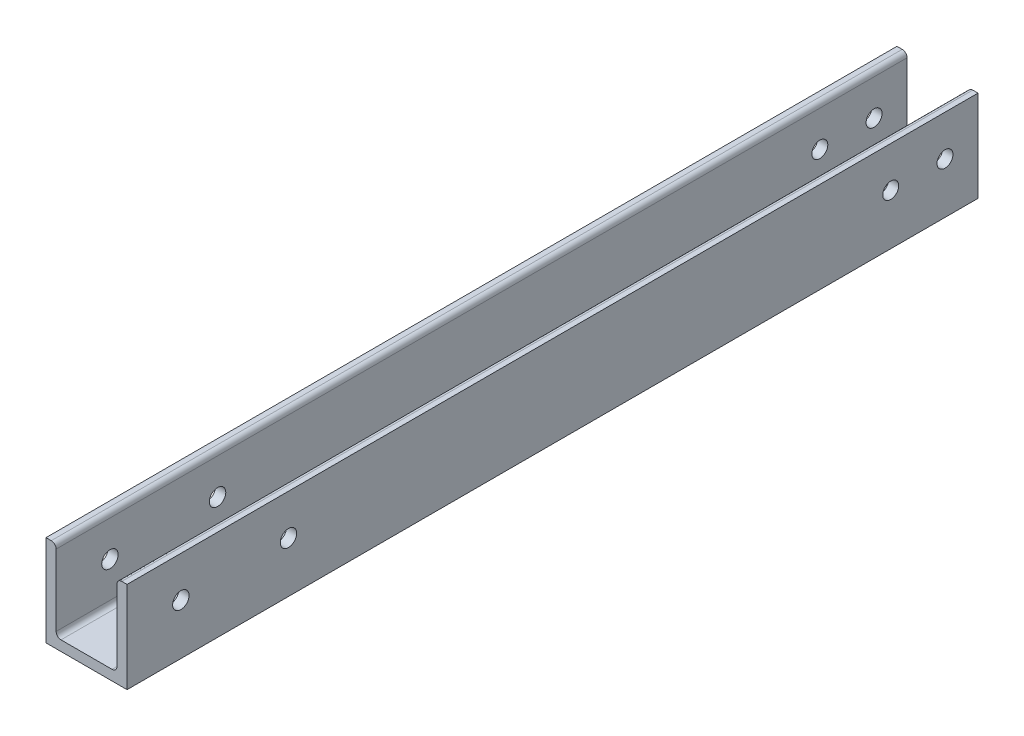
ISO-10303-21;
HEADER;
FILE_DESCRIPTION(('STEP AP214'),'2;1');
FILE_NAME('part.step','',(''),(''),'','','');
FILE_SCHEMA(('AUTOMOTIVE_DESIGN { 1 0 10303 214 1 1 1 1 }'));
ENDSEC;
DATA;
#1=APPLICATION_CONTEXT('core data for automotive mechanical design processes');
#2=APPLICATION_PROTOCOL_DEFINITION('international standard','automotive_design',2000,#1);
#3=PRODUCT_CONTEXT('',#1,'mechanical');
#4=PRODUCT('Part','Part','',(#3));
#5=PRODUCT_RELATED_PRODUCT_CATEGORY('part','',(#4));
#6=PRODUCT_DEFINITION_FORMATION('','',#4);
#7=PRODUCT_DEFINITION_CONTEXT('part definition',#1,'design');
#8=PRODUCT_DEFINITION('design','',#6,#7);
#9=PRODUCT_DEFINITION_SHAPE('','',#8);
#10=(LENGTH_UNIT() NAMED_UNIT(*) SI_UNIT(.MILLI.,.METRE.));
#11=(NAMED_UNIT(*) PLANE_ANGLE_UNIT() SI_UNIT($,.RADIAN.));
#12=(NAMED_UNIT(*) SI_UNIT($,.STERADIAN.) SOLID_ANGLE_UNIT());
#13=UNCERTAINTY_MEASURE_WITH_UNIT(LENGTH_MEASURE(1.E-05),#10,'distance_accuracy_value','');
#14=(GEOMETRIC_REPRESENTATION_CONTEXT(3) GLOBAL_UNCERTAINTY_ASSIGNED_CONTEXT((#13)) GLOBAL_UNIT_ASSIGNED_CONTEXT((#10,
#11,#12)) REPRESENTATION_CONTEXT('',''));
#15=CARTESIAN_POINT('',(0.,0.,0.));
#16=DIRECTION('',(0.,0.,1.));
#17=DIRECTION('',(1.,0.,0.));
#18=AXIS2_PLACEMENT_3D('',#15,#16,#17);
#19=CARTESIAN_POINT('',(-12.7,0.,266.7));
#20=DIRECTION('',(0.,1.,0.));
#21=DIRECTION('',(-1.,0.,0.));
#22=AXIS2_PLACEMENT_3D('',#19,#20,#21);
#23=PLANE('',#22);
#24=DIRECTION('',(1.,0.,0.));
#25=VECTOR('',#24,1.);
#26=CARTESIAN_POINT('',(-12.7,0.,0.));
#27=LINE('',#26,#25);
#28=CARTESIAN_POINT('',(-12.7,0.,0.));
#29=VERTEX_POINT('',#28);
#30=CARTESIAN_POINT('',(12.7,0.,0.));
#31=VERTEX_POINT('',#30);
#32=EDGE_CURVE('E163',#29,#31,#27,.T.);
#33=ORIENTED_EDGE('',*,*,#32,.T.);
#34=DIRECTION('',(0.,0.,-1.));
#35=VECTOR('',#34,1.);
#36=CARTESIAN_POINT('',(12.7,0.,266.7));
#37=LINE('',#36,#35);
#38=CARTESIAN_POINT('',(12.7,0.,266.7));
#39=VERTEX_POINT('',#38);
#40=EDGE_CURVE('E47',#39,#31,#37,.T.);
#41=ORIENTED_EDGE('',*,*,#40,.F.);
#42=DIRECTION('',(1.,0.,0.));
#43=VECTOR('',#42,1.);
#44=CARTESIAN_POINT('',(-12.7,0.,266.7));
#45=LINE('',#44,#43);
#46=CARTESIAN_POINT('',(-12.7,0.,266.7));
#47=VERTEX_POINT('',#46);
#48=EDGE_CURVE('E111',#47,#39,#45,.T.);
#49=ORIENTED_EDGE('',*,*,#48,.F.);
#50=DIRECTION('',(0.,0.,-1.));
#51=VECTOR('',#50,1.);
#52=CARTESIAN_POINT('',(-12.7,0.,266.7));
#53=LINE('',#52,#51);
#54=EDGE_CURVE('E11',#47,#29,#53,.T.);
#55=ORIENTED_EDGE('',*,*,#54,.T.);
#56=EDGE_LOOP('',(#33,#41,#49,#55));
#57=FACE_BOUND('',#56,.T.);
#58=ADVANCED_FACE('F39',(#57),#23,.F.);
#59=CARTESIAN_POINT('',(12.7,6.35,266.7));
#60=DIRECTION('',(-1.,0.,0.));
#61=DIRECTION('',(0.,-1.,0.));
#62=AXIS2_PLACEMENT_3D('',#59,#60,#61);
#63=PLANE('',#62);
#64=CARTESIAN_POINT('',(12.7,15.8750000003487,10.3499999999998));
#65=DIRECTION('',(-1.,0.,0.));
#66=DIRECTION('',(0.,0.,1.));
#67=AXIS2_PLACEMENT_3D('',#64,#65,#66);
#68=CIRCLE('',#67,2.5);
#69=CARTESIAN_POINT('',(12.7,15.8750000003487,12.8499999999998));
#70=VERTEX_POINT('',#69);
#71=EDGE_CURVE('E280',#70,#70,#68,.T.);
#72=ORIENTED_EDGE('',*,*,#71,.T.);
#73=EDGE_LOOP('',(#72));
#74=FACE_BOUND('',#73,.T.);
#75=CARTESIAN_POINT('',(12.7,15.8750000003487,27.3499999999998));
#76=DIRECTION('',(-1.,0.,0.));
#77=DIRECTION('',(0.,0.,1.));
#78=AXIS2_PLACEMENT_3D('',#75,#76,#77);
#79=CIRCLE('',#78,2.5);
#80=CARTESIAN_POINT('',(12.7,15.8750000003487,29.8499999999998));
#81=VERTEX_POINT('',#80);
#82=EDGE_CURVE('E284',#81,#81,#79,.T.);
#83=ORIENTED_EDGE('',*,*,#82,.T.);
#84=EDGE_LOOP('',(#83));
#85=FACE_BOUND('',#84,.T.);
#86=CARTESIAN_POINT('',(12.7,15.875,216.108705961791));
#87=DIRECTION('',(1.,0.,0.));
#88=DIRECTION('',(0.,1.,0.));
#89=AXIS2_PLACEMENT_3D('',#86,#87,#88);
#90=CIRCLE('',#89,2.575);
#91=CARTESIAN_POINT('',(12.7,18.45,216.108705961791));
#92=VERTEX_POINT('',#91);
#93=EDGE_CURVE('E288',#92,#92,#90,.T.);
#94=ORIENTED_EDGE('',*,*,#93,.F.);
#95=EDGE_LOOP('',(#94));
#96=FACE_BOUND('',#95,.T.);
#97=CARTESIAN_POINT('',(12.7,15.875,249.836235320597));
#98=DIRECTION('',(1.,0.,0.));
#99=DIRECTION('',(0.,1.,0.));
#100=AXIS2_PLACEMENT_3D('',#97,#98,#99);
#101=CIRCLE('',#100,2.575);
#102=CARTESIAN_POINT('',(12.7,18.45,249.836235320597));
#103=VERTEX_POINT('',#102);
#104=EDGE_CURVE('E291',#103,#103,#101,.T.);
#105=ORIENTED_EDGE('',*,*,#104,.F.);
#106=EDGE_LOOP('',(#105));
#107=FACE_BOUND('',#106,.T.);
#108=DIRECTION('',(0.,1.,0.));
#109=VECTOR('',#108,1.);
#110=CARTESIAN_POINT('',(12.7,6.35,0.));
#111=LINE('',#110,#109);
#112=CARTESIAN_POINT('',(12.7,28.575,0.));
#113=VERTEX_POINT('',#112);
#114=EDGE_CURVE('E166',#31,#113,#111,.T.);
#115=ORIENTED_EDGE('',*,*,#114,.T.);
#116=DIRECTION('',(0.,0.,-1.));
#117=VECTOR('',#116,1.);
#118=CARTESIAN_POINT('',(12.7,28.575,266.7));
#119=LINE('',#118,#117);
#120=CARTESIAN_POINT('',(12.7,28.575,266.7));
#121=VERTEX_POINT('',#120);
#122=EDGE_CURVE('E204',#121,#113,#119,.T.);
#123=ORIENTED_EDGE('',*,*,#122,.F.);
#124=DIRECTION('',(0.,1.,0.));
#125=VECTOR('',#124,1.);
#126=CARTESIAN_POINT('',(12.7,0.,266.7));
#127=LINE('',#126,#125);
#128=EDGE_CURVE('E211',#39,#121,#127,.T.);
#129=ORIENTED_EDGE('',*,*,#128,.F.);
#130=ORIENTED_EDGE('',*,*,#40,.T.);
#131=EDGE_LOOP('',(#115,#123,#129,#130));
#132=FACE_BOUND('',#131,.T.);
#133=ADVANCED_FACE('F209',(#74,#85,#96,#107,#132),#63,.F.);
#134=CARTESIAN_POINT('',(12.7,28.575,266.7));
#135=DIRECTION('',(0.,-1.,0.));
#136=DIRECTION('',(1.,0.,0.));
#137=AXIS2_PLACEMENT_3D('',#134,#135,#136);
#138=PLANE('',#137);
#139=DIRECTION('',(-1.,0.,0.));
#140=VECTOR('',#139,1.);
#141=CARTESIAN_POINT('',(12.7,28.575,0.));
#142=LINE('',#141,#140);
#143=CARTESIAN_POINT('',(11.049,28.575,0.));
#144=VERTEX_POINT('',#143);
#145=EDGE_CURVE('E169',#113,#144,#142,.T.);
#146=ORIENTED_EDGE('',*,*,#145,.T.);
#147=DIRECTION('',(0.,0.,-1.));
#148=VECTOR('',#147,1.);
#149=CARTESIAN_POINT('',(11.049,28.575,266.7));
#150=LINE('',#149,#148);
#151=CARTESIAN_POINT('',(11.049,28.575,266.7));
#152=VERTEX_POINT('',#151);
#153=EDGE_CURVE('E201',#152,#144,#150,.T.);
#154=ORIENTED_EDGE('',*,*,#153,.F.);
#155=DIRECTION('',(-1.,0.,0.));
#156=VECTOR('',#155,1.);
#157=CARTESIAN_POINT('',(12.7,28.575,266.7));
#158=LINE('',#157,#156);
#159=EDGE_CURVE('E230',#121,#152,#158,.T.);
#160=ORIENTED_EDGE('',*,*,#159,.F.);
#161=ORIENTED_EDGE('',*,*,#122,.T.);
#162=EDGE_LOOP('',(#146,#154,#160,#161));
#163=FACE_BOUND('',#162,.T.);
#164=ADVANCED_FACE('F221',(#163),#138,.F.);
#165=CARTESIAN_POINT('',(11.049,27.051,266.7));
#166=DIRECTION('',(0.,0.,-1.));
#167=DIRECTION('',(-1.,0.,0.));
#168=AXIS2_PLACEMENT_3D('',#165,#166,#167);
#169=CYLINDRICAL_SURFACE('',#168,1.524);
#170=CARTESIAN_POINT('',(11.049,27.051,0.));
#171=DIRECTION('',(0.,0.,1.));
#172=DIRECTION('',(1.,0.,0.));
#173=AXIS2_PLACEMENT_3D('',#170,#171,#172);
#174=CIRCLE('',#173,1.524);
#175=CARTESIAN_POINT('',(9.52499999999999,27.051,0.));
#176=VERTEX_POINT('',#175);
#177=EDGE_CURVE('E171',#144,#176,#174,.T.);
#178=ORIENTED_EDGE('',*,*,#177,.T.);
#179=DIRECTION('',(0.,0.,-1.));
#180=VECTOR('',#179,1.);
#181=CARTESIAN_POINT('',(9.52499999999999,27.051,266.7));
#182=LINE('',#181,#180);
#183=CARTESIAN_POINT('',(9.52499999999999,27.051,266.7));
#184=VERTEX_POINT('',#183);
#185=EDGE_CURVE('E198',#184,#176,#182,.T.);
#186=ORIENTED_EDGE('',*,*,#185,.F.);
#187=CARTESIAN_POINT('',(11.049,27.051,266.7));
#188=DIRECTION('',(0.,0.,1.));
#189=DIRECTION('',(1.,0.,0.));
#190=AXIS2_PLACEMENT_3D('',#187,#188,#189);
#191=CIRCLE('',#190,1.524);
#192=EDGE_CURVE('E227',#152,#184,#191,.T.);
#193=ORIENTED_EDGE('',*,*,#192,.F.);
#194=ORIENTED_EDGE('',*,*,#153,.T.);
#195=EDGE_LOOP('',(#178,#186,#193,#194));
#196=FACE_BOUND('',#195,.T.);
#197=ADVANCED_FACE('F225',(#196),#169,.T.);
#198=CARTESIAN_POINT('',(9.52499999999999,4.699,266.7));
#199=DIRECTION('',(1.,0.,0.));
#200=DIRECTION('',(0.,1.,0.));
#201=AXIS2_PLACEMENT_3D('',#198,#199,#200);
#202=PLANE('',#201);
#203=CARTESIAN_POINT('',(9.52499999999999,15.8750000003487,10.3499999999998));
#204=DIRECTION('',(1.,0.,0.));
#205=DIRECTION('',(0.,1.,0.));
#206=AXIS2_PLACEMENT_3D('',#203,#204,#205);
#207=CIRCLE('',#206,2.5);
#208=CARTESIAN_POINT('',(9.52499999999999,18.3750000003487,10.3499999999998));
#209=VERTEX_POINT('',#208);
#210=EDGE_CURVE('E298',#209,#209,#207,.T.);
#211=ORIENTED_EDGE('',*,*,#210,.T.);
#212=EDGE_LOOP('',(#211));
#213=FACE_BOUND('',#212,.T.);
#214=CARTESIAN_POINT('',(9.52499999999999,15.8750000003487,27.3499999999998));
#215=DIRECTION('',(1.,0.,0.));
#216=DIRECTION('',(0.,1.,0.));
#217=AXIS2_PLACEMENT_3D('',#214,#215,#216);
#218=CIRCLE('',#217,2.5);
#219=CARTESIAN_POINT('',(9.52499999999999,18.3750000003487,27.3499999999998));
#220=VERTEX_POINT('',#219);
#221=EDGE_CURVE('E461',#220,#220,#218,.T.);
#222=ORIENTED_EDGE('',*,*,#221,.T.);
#223=EDGE_LOOP('',(#222));
#224=FACE_BOUND('',#223,.T.);
#225=CARTESIAN_POINT('',(9.52499999999999,15.875,216.108705961791));
#226=DIRECTION('',(1.,0.,0.));
#227=DIRECTION('',(0.,1.,0.));
#228=AXIS2_PLACEMENT_3D('',#225,#226,#227);
#229=CIRCLE('',#228,2.575);
#230=CARTESIAN_POINT('',(9.52499999999999,18.45,216.108705961791));
#231=VERTEX_POINT('',#230);
#232=EDGE_CURVE('E167',#231,#231,#229,.T.);
#233=ORIENTED_EDGE('',*,*,#232,.T.);
#234=EDGE_LOOP('',(#233));
#235=FACE_BOUND('',#234,.T.);
#236=CARTESIAN_POINT('',(9.52499999999999,15.875,249.836235320597));
#237=DIRECTION('',(1.,0.,0.));
#238=DIRECTION('',(0.,1.,0.));
#239=AXIS2_PLACEMENT_3D('',#236,#237,#238);
#240=CIRCLE('',#239,2.575);
#241=CARTESIAN_POINT('',(9.52499999999999,18.45,249.836235320597));
#242=VERTEX_POINT('',#241);
#243=EDGE_CURVE('E305',#242,#242,#240,.T.);
#244=ORIENTED_EDGE('',*,*,#243,.T.);
#245=EDGE_LOOP('',(#244));
#246=FACE_BOUND('',#245,.T.);
#247=DIRECTION('',(0.,-1.,0.));
#248=VECTOR('',#247,1.);
#249=CARTESIAN_POINT('',(9.52499999999999,4.699,0.));
#250=LINE('',#249,#248);
#251=CARTESIAN_POINT('',(9.52499999999999,4.699,0.));
#252=VERTEX_POINT('',#251);
#253=EDGE_CURVE('E173',#176,#252,#250,.T.);
#254=ORIENTED_EDGE('',*,*,#253,.T.);
#255=DIRECTION('',(0.,0.,-1.));
#256=VECTOR('',#255,1.);
#257=CARTESIAN_POINT('',(9.52499999999999,4.699,266.7));
#258=LINE('',#257,#256);
#259=CARTESIAN_POINT('',(9.52499999999999,4.699,266.7));
#260=VERTEX_POINT('',#259);
#261=EDGE_CURVE('E195',#260,#252,#258,.T.);
#262=ORIENTED_EDGE('',*,*,#261,.F.);
#263=DIRECTION('',(0.,-1.,0.));
#264=VECTOR('',#263,1.);
#265=CARTESIAN_POINT('',(9.52499999999999,4.699,266.7));
#266=LINE('',#265,#264);
#267=EDGE_CURVE('E229',#184,#260,#266,.T.);
#268=ORIENTED_EDGE('',*,*,#267,.F.);
#269=ORIENTED_EDGE('',*,*,#185,.T.);
#270=EDGE_LOOP('',(#254,#262,#268,#269));
#271=FACE_BOUND('',#270,.T.);
#272=ADVANCED_FACE('F254',(#213,#224,#235,#246,#271),#202,.F.);
#273=CARTESIAN_POINT('',(8.00099999999999,4.699,266.7));
#274=DIRECTION('',(0.,0.,-1.));
#275=DIRECTION('',(-1.,0.,0.));
#276=AXIS2_PLACEMENT_3D('',#273,#274,#275);
#277=CYLINDRICAL_SURFACE('',#276,1.524);
#278=CARTESIAN_POINT('',(8.00099999999999,4.699,0.));
#279=DIRECTION('',(0.,0.,-1.));
#280=DIRECTION('',(1.,0.,0.));
#281=AXIS2_PLACEMENT_3D('',#278,#279,#280);
#282=CIRCLE('',#281,1.524);
#283=CARTESIAN_POINT('',(8.00099999999999,3.175,0.));
#284=VERTEX_POINT('',#283);
#285=EDGE_CURVE('E175',#252,#284,#282,.T.);
#286=ORIENTED_EDGE('',*,*,#285,.T.);
#287=DIRECTION('',(0.,0.,-1.));
#288=VECTOR('',#287,1.);
#289=CARTESIAN_POINT('',(8.00099999999999,3.175,266.7));
#290=LINE('',#289,#288);
#291=CARTESIAN_POINT('',(8.00099999999999,3.175,266.7));
#292=VERTEX_POINT('',#291);
#293=EDGE_CURVE('E192',#292,#284,#290,.T.);
#294=ORIENTED_EDGE('',*,*,#293,.F.);
#295=CARTESIAN_POINT('',(8.00099999999999,4.699,266.7));
#296=DIRECTION('',(0.,0.,-1.));
#297=DIRECTION('',(1.,0.,0.));
#298=AXIS2_PLACEMENT_3D('',#295,#296,#297);
#299=CIRCLE('',#298,1.524);
#300=EDGE_CURVE('E232',#260,#292,#299,.T.);
#301=ORIENTED_EDGE('',*,*,#300,.F.);
#302=ORIENTED_EDGE('',*,*,#261,.T.);
#303=EDGE_LOOP('',(#286,#294,#301,#302));
#304=FACE_BOUND('',#303,.T.);
#305=ADVANCED_FACE('F251',(#304),#277,.F.);
#306=CARTESIAN_POINT('',(-8.001,3.175,266.7));
#307=DIRECTION('',(0.,-1.,0.));
#308=DIRECTION('',(0.,0.,-1.));
#309=AXIS2_PLACEMENT_3D('',#306,#307,#308);
#310=PLANE('',#309);
#311=DIRECTION('',(-1.,0.,0.));
#312=VECTOR('',#311,1.);
#313=CARTESIAN_POINT('',(-8.001,3.175,0.));
#314=LINE('',#313,#312);
#315=CARTESIAN_POINT('',(-8.001,3.175,0.));
#316=VERTEX_POINT('',#315);
#317=EDGE_CURVE('E177',#284,#316,#314,.T.);
#318=ORIENTED_EDGE('',*,*,#317,.T.);
#319=DIRECTION('',(0.,0.,-1.));
#320=VECTOR('',#319,1.);
#321=CARTESIAN_POINT('',(-8.001,3.175,266.7));
#322=LINE('',#321,#320);
#323=CARTESIAN_POINT('',(-8.001,3.175,266.7));
#324=VERTEX_POINT('',#323);
#325=EDGE_CURVE('E189',#324,#316,#322,.T.);
#326=ORIENTED_EDGE('',*,*,#325,.F.);
#327=DIRECTION('',(-1.,0.,0.));
#328=VECTOR('',#327,1.);
#329=CARTESIAN_POINT('',(-8.001,3.175,266.7));
#330=LINE('',#329,#328);
#331=EDGE_CURVE('E238',#292,#324,#330,.T.);
#332=ORIENTED_EDGE('',*,*,#331,.F.);
#333=ORIENTED_EDGE('',*,*,#293,.T.);
#334=EDGE_LOOP('',(#318,#326,#332,#333));
#335=FACE_BOUND('',#334,.T.);
#336=ADVANCED_FACE('F244',(#335),#310,.F.);
#337=CARTESIAN_POINT('',(-8.001,4.699,266.7));
#338=DIRECTION('',(0.,0.,-1.));
#339=DIRECTION('',(-1.,0.,0.));
#340=AXIS2_PLACEMENT_3D('',#337,#338,#339);
#341=CYLINDRICAL_SURFACE('',#340,1.524);
#342=CARTESIAN_POINT('',(-8.001,4.699,0.));
#343=DIRECTION('',(0.,0.,-1.));
#344=DIRECTION('',(-1.,0.,0.));
#345=AXIS2_PLACEMENT_3D('',#342,#343,#344);
#346=CIRCLE('',#345,1.524);
#347=CARTESIAN_POINT('',(-9.525,4.699,0.));
#348=VERTEX_POINT('',#347);
#349=EDGE_CURVE('E179',#316,#348,#346,.T.);
#350=ORIENTED_EDGE('',*,*,#349,.T.);
#351=DIRECTION('',(0.,0.,-1.));
#352=VECTOR('',#351,1.);
#353=CARTESIAN_POINT('',(-9.525,4.699,266.7));
#354=LINE('',#353,#352);
#355=CARTESIAN_POINT('',(-9.525,4.699,266.7));
#356=VERTEX_POINT('',#355);
#357=EDGE_CURVE('E152',#356,#348,#354,.T.);
#358=ORIENTED_EDGE('',*,*,#357,.F.);
#359=CARTESIAN_POINT('',(-8.001,4.699,266.7));
#360=DIRECTION('',(0.,0.,-1.));
#361=DIRECTION('',(-1.,0.,0.));
#362=AXIS2_PLACEMENT_3D('',#359,#360,#361);
#363=CIRCLE('',#362,1.524);
#364=EDGE_CURVE('E143',#324,#356,#363,.T.);
#365=ORIENTED_EDGE('',*,*,#364,.F.);
#366=ORIENTED_EDGE('',*,*,#325,.T.);
#367=EDGE_LOOP('',(#350,#358,#365,#366));
#368=FACE_BOUND('',#367,.T.);
#369=ADVANCED_FACE('F248',(#368),#341,.F.);
#370=CARTESIAN_POINT('',(-9.525,4.699,266.7));
#371=DIRECTION('',(-1.,0.,0.));
#372=DIRECTION('',(0.,0.,1.));
#373=AXIS2_PLACEMENT_3D('',#370,#371,#372);
#374=PLANE('',#373);
#375=CARTESIAN_POINT('',(-9.525,15.8750000003487,10.3499999999998));
#376=DIRECTION('',(-1.,0.,0.));
#377=DIRECTION('',(0.,0.,1.));
#378=AXIS2_PLACEMENT_3D('',#375,#376,#377);
#379=CIRCLE('',#378,2.5);
#380=CARTESIAN_POINT('',(-9.525,15.8750000003487,12.8499999999998));
#381=VERTEX_POINT('',#380);
#382=EDGE_CURVE('E458',#381,#381,#379,.T.);
#383=ORIENTED_EDGE('',*,*,#382,.T.);
#384=EDGE_LOOP('',(#383));
#385=FACE_BOUND('',#384,.T.);
#386=CARTESIAN_POINT('',(-9.525,15.8750000003487,27.3499999999998));
#387=DIRECTION('',(-1.,0.,0.));
#388=DIRECTION('',(0.,0.,1.));
#389=AXIS2_PLACEMENT_3D('',#386,#387,#388);
#390=CIRCLE('',#389,2.5);
#391=CARTESIAN_POINT('',(-9.525,15.8750000003487,29.8499999999998));
#392=VERTEX_POINT('',#391);
#393=EDGE_CURVE('E477',#392,#392,#390,.T.);
#394=ORIENTED_EDGE('',*,*,#393,.T.);
#395=EDGE_LOOP('',(#394));
#396=FACE_BOUND('',#395,.T.);
#397=CARTESIAN_POINT('',(-9.525,15.875,216.108705961791));
#398=DIRECTION('',(-1.,0.,0.));
#399=DIRECTION('',(0.,0.,1.));
#400=AXIS2_PLACEMENT_3D('',#397,#398,#399);
#401=CIRCLE('',#400,2.575);
#402=CARTESIAN_POINT('',(-9.525,15.875,218.683705961791));
#403=VERTEX_POINT('',#402);
#404=EDGE_CURVE('E308',#403,#403,#401,.T.);
#405=ORIENTED_EDGE('',*,*,#404,.T.);
#406=EDGE_LOOP('',(#405));
#407=FACE_BOUND('',#406,.T.);
#408=CARTESIAN_POINT('',(-9.525,15.875,249.836235320597));
#409=DIRECTION('',(-1.,0.,0.));
#410=DIRECTION('',(0.,0.,1.));
#411=AXIS2_PLACEMENT_3D('',#408,#409,#410);
#412=CIRCLE('',#411,2.575);
#413=CARTESIAN_POINT('',(-9.525,15.875,252.411235320597));
#414=VERTEX_POINT('',#413);
#415=EDGE_CURVE('E302',#414,#414,#412,.T.);
#416=ORIENTED_EDGE('',*,*,#415,.T.);
#417=EDGE_LOOP('',(#416));
#418=FACE_BOUND('',#417,.T.);
#419=DIRECTION('',(0.,1.,0.));
#420=VECTOR('',#419,1.);
#421=CARTESIAN_POINT('',(-9.525,4.699,0.));
#422=LINE('',#421,#420);
#423=CARTESIAN_POINT('',(-9.525,27.051,0.));
#424=VERTEX_POINT('',#423);
#425=EDGE_CURVE('E151',#348,#424,#422,.T.);
#426=ORIENTED_EDGE('',*,*,#425,.T.);
#427=DIRECTION('',(0.,0.,-1.));
#428=VECTOR('',#427,1.);
#429=CARTESIAN_POINT('',(-9.525,27.051,266.7));
#430=LINE('',#429,#428);
#431=CARTESIAN_POINT('',(-9.525,27.051,266.7));
#432=VERTEX_POINT('',#431);
#433=EDGE_CURVE('E148',#432,#424,#430,.T.);
#434=ORIENTED_EDGE('',*,*,#433,.F.);
#435=DIRECTION('',(0.,1.,0.));
#436=VECTOR('',#435,1.);
#437=CARTESIAN_POINT('',(-9.525,4.699,266.7));
#438=LINE('',#437,#436);
#439=EDGE_CURVE('E137',#356,#432,#438,.T.);
#440=ORIENTED_EDGE('',*,*,#439,.F.);
#441=ORIENTED_EDGE('',*,*,#357,.T.);
#442=EDGE_LOOP('',(#426,#434,#440,#441));
#443=FACE_BOUND('',#442,.T.);
#444=ADVANCED_FACE('F149',(#385,#396,#407,#418,#443),#374,.F.);
#445=CARTESIAN_POINT('',(-11.049,27.051,266.7));
#446=DIRECTION('',(0.,0.,-1.));
#447=DIRECTION('',(-1.,0.,0.));
#448=AXIS2_PLACEMENT_3D('',#445,#446,#447);
#449=CYLINDRICAL_SURFACE('',#448,1.524);
#450=CARTESIAN_POINT('',(-11.049,27.051,0.));
#451=DIRECTION('',(0.,0.,1.));
#452=DIRECTION('',(-1.,0.,0.));
#453=AXIS2_PLACEMENT_3D('',#450,#451,#452);
#454=CIRCLE('',#453,1.524);
#455=CARTESIAN_POINT('',(-11.049,28.575,0.));
#456=VERTEX_POINT('',#455);
#457=EDGE_CURVE('E97',#424,#456,#454,.T.);
#458=ORIENTED_EDGE('',*,*,#457,.T.);
#459=DIRECTION('',(0.,0.,-1.));
#460=VECTOR('',#459,1.);
#461=CARTESIAN_POINT('',(-11.049,28.575,266.7));
#462=LINE('',#461,#460);
#463=CARTESIAN_POINT('',(-11.049,28.575,266.7));
#464=VERTEX_POINT('',#463);
#465=EDGE_CURVE('E153',#464,#456,#462,.T.);
#466=ORIENTED_EDGE('',*,*,#465,.F.);
#467=CARTESIAN_POINT('',(-11.049,27.051,266.7));
#468=DIRECTION('',(0.,0.,1.));
#469=DIRECTION('',(-1.,0.,0.));
#470=AXIS2_PLACEMENT_3D('',#467,#468,#469);
#471=CIRCLE('',#470,1.524);
#472=EDGE_CURVE('E141',#432,#464,#471,.T.);
#473=ORIENTED_EDGE('',*,*,#472,.F.);
#474=ORIENTED_EDGE('',*,*,#433,.T.);
#475=EDGE_LOOP('',(#458,#466,#473,#474));
#476=FACE_BOUND('',#475,.T.);
#477=ADVANCED_FACE('F155',(#476),#449,.T.);
#478=CARTESIAN_POINT('',(-12.7,28.575,266.7));
#479=DIRECTION('',(0.,-1.,0.));
#480=DIRECTION('',(0.,0.,-1.));
#481=AXIS2_PLACEMENT_3D('',#478,#479,#480);
#482=PLANE('',#481);
#483=DIRECTION('',(-1.,0.,0.));
#484=VECTOR('',#483,1.);
#485=CARTESIAN_POINT('',(-12.7,28.575,0.));
#486=LINE('',#485,#484);
#487=CARTESIAN_POINT('',(-12.7,28.575,0.));
#488=VERTEX_POINT('',#487);
#489=EDGE_CURVE('E104',#456,#488,#486,.T.);
#490=ORIENTED_EDGE('',*,*,#489,.T.);
#491=DIRECTION('',(0.,0.,-1.));
#492=VECTOR('',#491,1.);
#493=CARTESIAN_POINT('',(-12.7,28.575,266.7));
#494=LINE('',#493,#492);
#495=CARTESIAN_POINT('',(-12.7,28.575,266.7));
#496=VERTEX_POINT('',#495);
#497=EDGE_CURVE('E159',#496,#488,#494,.T.);
#498=ORIENTED_EDGE('',*,*,#497,.F.);
#499=DIRECTION('',(-1.,0.,0.));
#500=VECTOR('',#499,1.);
#501=CARTESIAN_POINT('',(-12.7,28.575,266.7));
#502=LINE('',#501,#500);
#503=EDGE_CURVE('E157',#464,#496,#502,.T.);
#504=ORIENTED_EDGE('',*,*,#503,.F.);
#505=ORIENTED_EDGE('',*,*,#465,.T.);
#506=EDGE_LOOP('',(#490,#498,#504,#505));
#507=FACE_BOUND('',#506,.T.);
#508=ADVANCED_FACE('F315',(#507),#482,.F.);
#509=CARTESIAN_POINT('',(-12.7,3.175,266.7));
#510=DIRECTION('',(1.,0.,0.));
#511=DIRECTION('',(0.,0.,-1.));
#512=AXIS2_PLACEMENT_3D('',#509,#510,#511);
#513=PLANE('',#512);
#514=CARTESIAN_POINT('',(-12.7,15.8750000003487,10.3499999999998));
#515=DIRECTION('',(-1.,0.,0.));
#516=DIRECTION('',(0.,0.,1.));
#517=AXIS2_PLACEMENT_3D('',#514,#515,#516);
#518=CIRCLE('',#517,2.5);
#519=CARTESIAN_POINT('',(-12.7,15.8750000003487,12.8499999999998));
#520=VERTEX_POINT('',#519);
#521=EDGE_CURVE('E484',#520,#520,#518,.T.);
#522=ORIENTED_EDGE('',*,*,#521,.F.);
#523=EDGE_LOOP('',(#522));
#524=FACE_BOUND('',#523,.T.);
#525=CARTESIAN_POINT('',(-12.7,15.8750000003487,27.3499999999998));
#526=DIRECTION('',(-1.,0.,0.));
#527=DIRECTION('',(0.,0.,1.));
#528=AXIS2_PLACEMENT_3D('',#525,#526,#527);
#529=CIRCLE('',#528,2.5);
#530=CARTESIAN_POINT('',(-12.7,15.8750000003487,29.8499999999998));
#531=VERTEX_POINT('',#530);
#532=EDGE_CURVE('E481',#531,#531,#529,.T.);
#533=ORIENTED_EDGE('',*,*,#532,.F.);
#534=EDGE_LOOP('',(#533));
#535=FACE_BOUND('',#534,.T.);
#536=CARTESIAN_POINT('',(-12.7,15.875,216.108705961791));
#537=DIRECTION('',(1.,0.,0.));
#538=DIRECTION('',(0.,1.,0.));
#539=AXIS2_PLACEMENT_3D('',#536,#537,#538);
#540=CIRCLE('',#539,2.575);
#541=CARTESIAN_POINT('',(-12.7,18.45,216.108705961791));
#542=VERTEX_POINT('',#541);
#543=EDGE_CURVE('E295',#542,#542,#540,.T.);
#544=ORIENTED_EDGE('',*,*,#543,.T.);
#545=EDGE_LOOP('',(#544));
#546=FACE_BOUND('',#545,.T.);
#547=CARTESIAN_POINT('',(-12.7,15.875,249.836235320597));
#548=DIRECTION('',(1.,0.,0.));
#549=DIRECTION('',(0.,1.,0.));
#550=AXIS2_PLACEMENT_3D('',#547,#548,#549);
#551=CIRCLE('',#550,2.575);
#552=CARTESIAN_POINT('',(-12.7,18.45,249.836235320597));
#553=VERTEX_POINT('',#552);
#554=EDGE_CURVE('E293',#553,#553,#551,.T.);
#555=ORIENTED_EDGE('',*,*,#554,.T.);
#556=EDGE_LOOP('',(#555));
#557=FACE_BOUND('',#556,.T.);
#558=DIRECTION('',(0.,-1.,0.));
#559=VECTOR('',#558,1.);
#560=CARTESIAN_POINT('',(-12.7,3.175,0.));
#561=LINE('',#560,#559);
#562=EDGE_CURVE('E184',#488,#29,#561,.T.);
#563=ORIENTED_EDGE('',*,*,#562,.T.);
#564=ORIENTED_EDGE('',*,*,#54,.F.);
#565=DIRECTION('',(0.,-1.,0.));
#566=VECTOR('',#565,1.);
#567=CARTESIAN_POINT('',(-12.7,0.,266.7));
#568=LINE('',#567,#566);
#569=EDGE_CURVE('E55',#496,#47,#568,.T.);
#570=ORIENTED_EDGE('',*,*,#569,.F.);
#571=ORIENTED_EDGE('',*,*,#497,.T.);
#572=EDGE_LOOP('',(#563,#564,#570,#571));
#573=FACE_BOUND('',#572,.T.);
#574=ADVANCED_FACE('F314',(#524,#535,#546,#557,#573),#513,.F.);
#575=CARTESIAN_POINT('',(-11.049,27.051,266.7));
#576=DIRECTION('',(0.,0.,-1.));
#577=DIRECTION('',(-1.,0.,0.));
#578=AXIS2_PLACEMENT_3D('',#575,#576,#577);
#579=PLANE('',#578);
#580=ORIENTED_EDGE('',*,*,#569,.T.);
#581=ORIENTED_EDGE('',*,*,#48,.T.);
#582=ORIENTED_EDGE('',*,*,#128,.T.);
#583=ORIENTED_EDGE('',*,*,#159,.T.);
#584=ORIENTED_EDGE('',*,*,#192,.T.);
#585=ORIENTED_EDGE('',*,*,#267,.T.);
#586=ORIENTED_EDGE('',*,*,#300,.T.);
#587=ORIENTED_EDGE('',*,*,#331,.T.);
#588=ORIENTED_EDGE('',*,*,#364,.T.);
#589=ORIENTED_EDGE('',*,*,#439,.T.);
#590=ORIENTED_EDGE('',*,*,#472,.T.);
#591=ORIENTED_EDGE('',*,*,#503,.T.);
#592=EDGE_LOOP('',(#580,#581,#582,#583,#584,#585,#586,#587,#588,#589,#590,#591));
#593=FACE_BOUND('',#592,.T.);
#594=ADVANCED_FACE('F139',(#593),#579,.F.);
#595=CARTESIAN_POINT('',(-11.049,27.051,0.));
#596=DIRECTION('',(0.,0.,-1.));
#597=DIRECTION('',(-1.,0.,0.));
#598=AXIS2_PLACEMENT_3D('',#595,#596,#597);
#599=PLANE('',#598);
#600=ORIENTED_EDGE('',*,*,#32,.F.);
#601=ORIENTED_EDGE('',*,*,#562,.F.);
#602=ORIENTED_EDGE('',*,*,#489,.F.);
#603=ORIENTED_EDGE('',*,*,#457,.F.);
#604=ORIENTED_EDGE('',*,*,#425,.F.);
#605=ORIENTED_EDGE('',*,*,#349,.F.);
#606=ORIENTED_EDGE('',*,*,#317,.F.);
#607=ORIENTED_EDGE('',*,*,#285,.F.);
#608=ORIENTED_EDGE('',*,*,#253,.F.);
#609=ORIENTED_EDGE('',*,*,#177,.F.);
#610=ORIENTED_EDGE('',*,*,#145,.F.);
#611=ORIENTED_EDGE('',*,*,#114,.F.);
#612=EDGE_LOOP('',(#600,#601,#602,#603,#604,#605,#606,#607,#608,#609,#610,#611));
#613=FACE_BOUND('',#612,.T.);
#614=ADVANCED_FACE('F215',(#613),#599,.T.);
#615=CARTESIAN_POINT('',(-12.7,15.875,249.836235320597));
#616=DIRECTION('',(1.,0.,0.));
#617=DIRECTION('',(0.,1.,0.));
#618=AXIS2_PLACEMENT_3D('',#615,#616,#617);
#619=CYLINDRICAL_SURFACE('',#618,2.575);
#620=ORIENTED_EDGE('',*,*,#554,.F.);
#621=EDGE_LOOP('',(#620));
#622=FACE_BOUND('',#621,.T.);
#623=ORIENTED_EDGE('',*,*,#415,.F.);
#624=EDGE_LOOP('',(#623));
#625=FACE_BOUND('',#624,.T.);
#626=ADVANCED_FACE('F382',(#622,#625),#619,.F.);
#627=CARTESIAN_POINT('',(-12.7,15.875,216.108705961791));
#628=DIRECTION('',(1.,0.,0.));
#629=DIRECTION('',(0.,1.,0.));
#630=AXIS2_PLACEMENT_3D('',#627,#628,#629);
#631=CYLINDRICAL_SURFACE('',#630,2.575);
#632=ORIENTED_EDGE('',*,*,#543,.F.);
#633=EDGE_LOOP('',(#632));
#634=FACE_BOUND('',#633,.T.);
#635=ORIENTED_EDGE('',*,*,#404,.F.);
#636=EDGE_LOOP('',(#635));
#637=FACE_BOUND('',#636,.T.);
#638=ADVANCED_FACE('F390',(#634,#637),#631,.F.);
#639=ORIENTED_EDGE('',*,*,#104,.T.);
#640=EDGE_LOOP('',(#639));
#641=FACE_BOUND('',#640,.T.);
#642=ORIENTED_EDGE('',*,*,#243,.F.);
#643=EDGE_LOOP('',(#642));
#644=FACE_BOUND('',#643,.T.);
#645=ADVANCED_FACE('F393',(#641,#644),#619,.F.);
#646=ORIENTED_EDGE('',*,*,#93,.T.);
#647=EDGE_LOOP('',(#646));
#648=FACE_BOUND('',#647,.T.);
#649=ORIENTED_EDGE('',*,*,#232,.F.);
#650=EDGE_LOOP('',(#649));
#651=FACE_BOUND('',#650,.T.);
#652=ADVANCED_FACE('F403',(#648,#651),#631,.F.);
#653=CARTESIAN_POINT('',(12.7,15.8750000003487,27.3499999999998));
#654=DIRECTION('',(-1.,0.,0.));
#655=DIRECTION('',(0.,0.,1.));
#656=AXIS2_PLACEMENT_3D('',#653,#654,#655);
#657=CYLINDRICAL_SURFACE('',#656,2.5);
#658=ORIENTED_EDGE('',*,*,#532,.T.);
#659=EDGE_LOOP('',(#658));
#660=FACE_BOUND('',#659,.T.);
#661=ORIENTED_EDGE('',*,*,#393,.F.);
#662=EDGE_LOOP('',(#661));
#663=FACE_BOUND('',#662,.T.);
#664=ADVANCED_FACE('F417',(#660,#663),#657,.F.);
#665=CARTESIAN_POINT('',(12.7,15.8750000003487,10.3499999999998));
#666=DIRECTION('',(-1.,0.,0.));
#667=DIRECTION('',(0.,0.,1.));
#668=AXIS2_PLACEMENT_3D('',#665,#666,#667);
#669=CYLINDRICAL_SURFACE('',#668,2.5);
#670=ORIENTED_EDGE('',*,*,#521,.T.);
#671=EDGE_LOOP('',(#670));
#672=FACE_BOUND('',#671,.T.);
#673=ORIENTED_EDGE('',*,*,#382,.F.);
#674=EDGE_LOOP('',(#673));
#675=FACE_BOUND('',#674,.T.);
#676=ADVANCED_FACE('F425',(#672,#675),#669,.F.);
#677=ORIENTED_EDGE('',*,*,#82,.F.);
#678=EDGE_LOOP('',(#677));
#679=FACE_BOUND('',#678,.T.);
#680=ORIENTED_EDGE('',*,*,#221,.F.);
#681=EDGE_LOOP('',(#680));
#682=FACE_BOUND('',#681,.T.);
#683=ADVANCED_FACE('F428',(#679,#682),#657,.F.);
#684=ORIENTED_EDGE('',*,*,#71,.F.);
#685=EDGE_LOOP('',(#684));
#686=FACE_BOUND('',#685,.T.);
#687=ORIENTED_EDGE('',*,*,#210,.F.);
#688=EDGE_LOOP('',(#687));
#689=FACE_BOUND('',#688,.T.);
#690=ADVANCED_FACE('F438',(#686,#689),#669,.F.);
#691=CLOSED_SHELL('',(#58,#133,#164,#197,#272,#305,#336,#369,#444,#477,#508,#574,#594,#614,#626,
#638,#645,#652,#664,#676,#683,#690));
#692=MANIFOLD_SOLID_BREP('B2',#691);
#693=ADVANCED_BREP_SHAPE_REPRESENTATION('',(#18,#692),#14);
#694=SHAPE_DEFINITION_REPRESENTATION(#9,#693);
ENDSEC;
END-ISO-10303-21;
